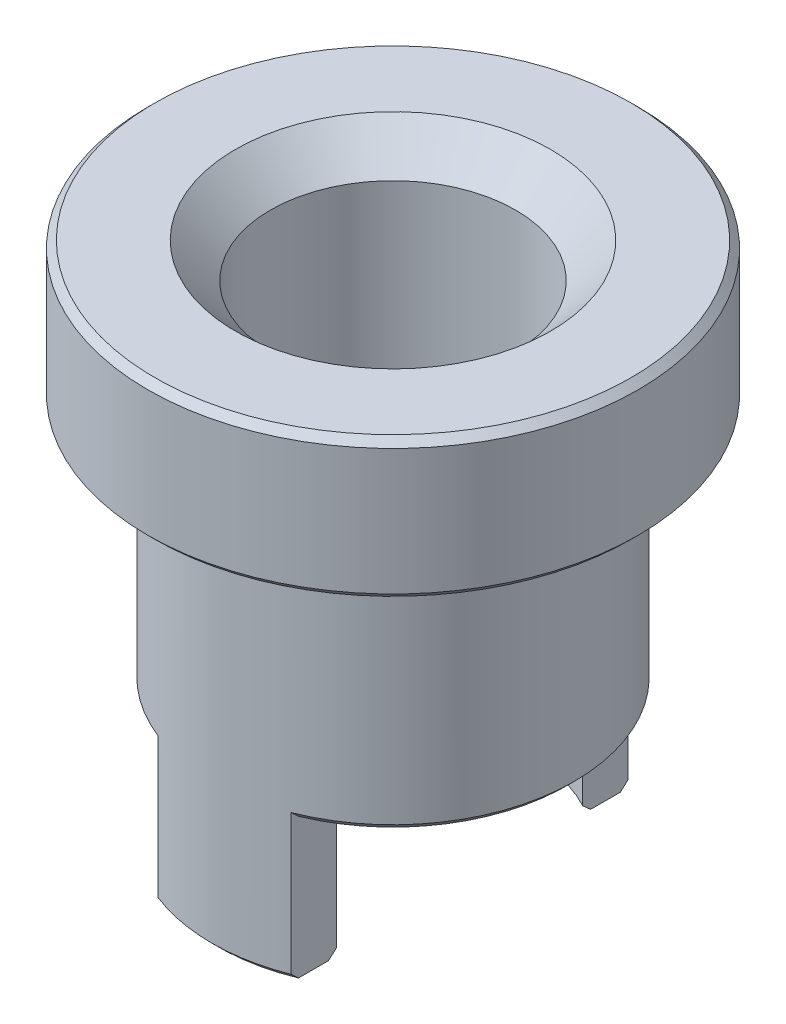
ISO-10303-21;
HEADER;
FILE_DESCRIPTION(('STEP AP214'),'2;1');
FILE_NAME('part.step','',(''),(''),'','','');
FILE_SCHEMA(('AUTOMOTIVE_DESIGN { 1 0 10303 214 1 1 1 1 }'));
ENDSEC;
DATA;
#1=APPLICATION_CONTEXT('core data for automotive mechanical design processes');
#2=APPLICATION_PROTOCOL_DEFINITION('international standard','automotive_design',2000,#1);
#3=PRODUCT_CONTEXT('',#1,'mechanical');
#4=PRODUCT('Part','Part','',(#3));
#5=PRODUCT_RELATED_PRODUCT_CATEGORY('part','',(#4));
#6=PRODUCT_DEFINITION_FORMATION('','',#4);
#7=PRODUCT_DEFINITION_CONTEXT('part definition',#1,'design');
#8=PRODUCT_DEFINITION('design','',#6,#7);
#9=PRODUCT_DEFINITION_SHAPE('','',#8);
#10=(LENGTH_UNIT() NAMED_UNIT(*) SI_UNIT(.MILLI.,.METRE.));
#11=(NAMED_UNIT(*) PLANE_ANGLE_UNIT() SI_UNIT($,.RADIAN.));
#12=(NAMED_UNIT(*) SI_UNIT($,.STERADIAN.) SOLID_ANGLE_UNIT());
#13=UNCERTAINTY_MEASURE_WITH_UNIT(LENGTH_MEASURE(1.E-05),#10,'distance_accuracy_value','');
#14=(GEOMETRIC_REPRESENTATION_CONTEXT(3) GLOBAL_UNCERTAINTY_ASSIGNED_CONTEXT((#13)) GLOBAL_UNIT_ASSIGNED_CONTEXT((#10,
#11,#12)) REPRESENTATION_CONTEXT('',''));
#15=CARTESIAN_POINT('',(0.,0.,0.));
#16=DIRECTION('',(0.,0.,1.));
#17=DIRECTION('',(1.,0.,0.));
#18=AXIS2_PLACEMENT_3D('',#15,#16,#17);
#19=CARTESIAN_POINT('',(1.9,4.,-7.));
#20=DIRECTION('',(0.,1.,0.));
#21=DIRECTION('',(0.,0.,1.));
#22=AXIS2_PLACEMENT_3D('',#19,#20,#21);
#23=PLANE('',#22);
#24=DIRECTION('',(0.,0.,1.));
#25=VECTOR('',#24,1.);
#26=CARTESIAN_POINT('',(-1.9,4.,-7.));
#27=LINE('',#26,#25);
#28=CARTESIAN_POINT('',(-1.9,4.,4.07921561087424));
#29=VERTEX_POINT('',#28);
#30=CARTESIAN_POINT('',(-1.9,4.,4.59789353943738));
#31=VERTEX_POINT('',#30);
#32=EDGE_CURVE('E385',#29,#31,#27,.T.);
#33=ORIENTED_EDGE('',*,*,#32,.T.);
#34=CARTESIAN_POINT('',(0.,4.,0.));
#35=DIRECTION('',(0.,1.,0.));
#36=DIRECTION('',(0.,0.,1.));
#37=AXIS2_PLACEMENT_3D('',#34,#35,#36);
#38=CIRCLE('',#37,4.975);
#39=CARTESIAN_POINT('',(-1.9,4.,-4.59789353943738));
#40=VERTEX_POINT('',#39);
#41=EDGE_CURVE('E325',#31,#40,#38,.F.);
#42=ORIENTED_EDGE('',*,*,#41,.T.);
#43=CARTESIAN_POINT('',(-1.9,4.,-4.07921561087424));
#44=VERTEX_POINT('',#43);
#45=EDGE_CURVE('E186',#40,#44,#27,.T.);
#46=ORIENTED_EDGE('',*,*,#45,.T.);
#47=CARTESIAN_POINT('',(0.,4.,0.));
#48=DIRECTION('',(0.,1.,0.));
#49=DIRECTION('',(0.,0.,1.));
#50=AXIS2_PLACEMENT_3D('',#47,#48,#49);
#51=CIRCLE('',#50,4.50000000000001);
#52=EDGE_CURVE('E192',#44,#29,#51,.T.);
#53=ORIENTED_EDGE('',*,*,#52,.T.);
#54=EDGE_LOOP('',(#33,#42,#46,#53));
#55=FACE_BOUND('',#54,.T.);
#56=ADVANCED_FACE('F39',(#55),#23,.F.);
#57=CARTESIAN_POINT('',(0.,26.7621951219513,0.));
#58=DIRECTION('',(0.,1.,0.));
#59=DIRECTION('',(0.,0.,1.));
#60=AXIS2_PLACEMENT_3D('',#57,#58,#59);
#61=CYLINDRICAL_SURFACE('',#60,3.5);
#62=CARTESIAN_POINT('',(0.,14.,0.));
#63=DIRECTION('',(0.,-1.,0.));
#64=DIRECTION('',(0.,0.,-1.));
#65=AXIS2_PLACEMENT_3D('',#62,#63,#64);
#66=CIRCLE('',#65,3.5);
#67=CARTESIAN_POINT('',(0.,14.,-3.5));
#68=VERTEX_POINT('',#67);
#69=EDGE_CURVE('E199',#68,#68,#66,.F.);
#70=ORIENTED_EDGE('',*,*,#69,.T.);
#71=EDGE_LOOP('',(#70));
#72=FACE_BOUND('',#71,.T.);
#73=CARTESIAN_POINT('',(0.,5.00000000000002,0.));
#74=DIRECTION('',(0.,1.,0.));
#75=DIRECTION('',(0.,0.,1.));
#76=AXIS2_PLACEMENT_3D('',#73,#74,#75);
#77=CIRCLE('',#76,3.5);
#78=CARTESIAN_POINT('',(0.,5.00000000000002,3.5));
#79=VERTEX_POINT('',#78);
#80=EDGE_CURVE('E438',#79,#79,#77,.F.);
#81=ORIENTED_EDGE('',*,*,#80,.T.);
#82=EDGE_LOOP('',(#81));
#83=FACE_BOUND('',#82,.T.);
#84=ADVANCED_FACE('F238',(#72,#83),#61,.F.);
#85=CARTESIAN_POINT('',(1.9,0.,-7.));
#86=DIRECTION('',(-1.,0.,0.));
#87=DIRECTION('',(0.,0.,1.));
#88=AXIS2_PLACEMENT_3D('',#85,#86,#87);
#89=PLANE('',#88);
#90=DIRECTION('',(0.,1.,0.));
#91=VECTOR('',#90,1.);
#92=CARTESIAN_POINT('',(1.9,26.7621951219513,4.81358753945537));
#93=LINE('',#92,#91);
#94=CARTESIAN_POINT('',(1.9,0.200000000000002,4.81358753945537));
#95=VERTEX_POINT('',#94);
#96=CARTESIAN_POINT('',(1.9,4.2,4.81358753945537));
#97=VERTEX_POINT('',#96);
#98=EDGE_CURVE('E308',#95,#97,#93,.T.);
#99=ORIENTED_EDGE('',*,*,#98,.F.);
#100=CARTESIAN_POINT('',(1.9,0.200000000000002,4.81358753945537));
#101=CARTESIAN_POINT('',(1.9,0.166609066003938,4.77769194990853));
#102=CARTESIAN_POINT('',(1.9,0.133246932549666,4.74176965536128));
#103=CARTESIAN_POINT('',(1.9,0.0665802658815418,4.66987165535664));
#104=CARTESIAN_POINT('',(1.9,0.0332757326691459,4.63389594989789));
#105=CARTESIAN_POINT('',(1.9,0.,4.59789353943738));
#106=B_SPLINE_CURVE_WITH_KNOTS('',3,(#100,#101,#102,#103,#104,#105),.UNSPECIFIED.,.F.,.F.,(4,2,
4),(0.,0.147074772641127,0.294149549002513),.UNSPECIFIED.);
#107=CARTESIAN_POINT('',(1.9,0.,4.59789353943738));
#108=VERTEX_POINT('',#107);
#109=EDGE_CURVE('E268',#95,#108,#106,.T.);
#110=ORIENTED_EDGE('',*,*,#109,.T.);
#111=DIRECTION('',(0.,0.,1.));
#112=VECTOR('',#111,1.);
#113=CARTESIAN_POINT('',(1.9,0.,-7.));
#114=LINE('',#113,#112);
#115=CARTESIAN_POINT('',(1.9,0.,3.74566416006561));
#116=VERTEX_POINT('',#115);
#117=EDGE_CURVE('E426',#116,#108,#114,.T.);
#118=ORIENTED_EDGE('',*,*,#117,.F.);
#119=CARTESIAN_POINT('',(1.9,0.,3.74566416006561));
#120=CARTESIAN_POINT('',(1.9,0.033458009401076,3.70815447063527));
#121=CARTESIAN_POINT('',(1.9,0.0668536796561595,3.67058954562483));
#122=CARTESIAN_POINT('',(1.9,0.133520346339527,3.59534921940429));
#123=CARTESIAN_POINT('',(1.9,0.16679134275111,3.5576738181794));
#124=CARTESIAN_POINT('',(1.9,0.199999999999999,3.51994318135961));
#125=B_SPLINE_CURVE_WITH_KNOTS('',3,(#119,#120,#121,#122,#123,#124),.UNSPECIFIED.,.F.,.F.,(4,2,
4),(0.,0.150789752454997,0.301579525109123),.UNSPECIFIED.);
#126=CARTESIAN_POINT('',(1.9,0.199999999999999,3.51994318135961));
#127=VERTEX_POINT('',#126);
#128=EDGE_CURVE('E263',#116,#127,#125,.T.);
#129=ORIENTED_EDGE('',*,*,#128,.T.);
#130=DIRECTION('',(0.,1.,0.));
#131=VECTOR('',#130,1.);
#132=CARTESIAN_POINT('',(1.9,0.,3.51994318135961));
#133=LINE('',#132,#131);
#134=CARTESIAN_POINT('',(1.9,4.50000000000001,3.51994318135961));
#135=VERTEX_POINT('',#134);
#136=EDGE_CURVE('E169',#135,#127,#133,.F.);
#137=ORIENTED_EDGE('',*,*,#136,.F.);
#138=CARTESIAN_POINT('',(1.9,4.50000000000001,3.51994318135961));
#139=CARTESIAN_POINT('',(1.9,4.45869946590342,3.56687547386379));
#140=CARTESIAN_POINT('',(1.9,4.41729486416082,3.61371604128772));
#141=CARTESIAN_POINT('',(1.9,4.33429720303416,3.70722880390633));
#142=CARTESIAN_POINT('',(1.9,4.29270414620101,3.75390100136478));
#143=CARTESIAN_POINT('',(1.9,4.20934823034379,3.84709326326857));
#144=CARTESIAN_POINT('',(1.9,4.16758537170122,3.8936133280553));
#145=CARTESIAN_POINT('',(1.9,4.08390479364052,3.9865151180706));
#146=CARTESIAN_POINT('',(1.9,4.04198707214102,4.0328968414246));
#147=CARTESIAN_POINT('',(1.9,4.,4.07921561087424));
#148=B_SPLINE_CURVE_WITH_KNOTS('',3,(#138,#139,#140,#141,#142,#143,#144,#145,#146,#147),
.UNSPECIFIED.,.F.,.F.,(4,2,2,2,4),(0.,0.187550662890622,0.375098794652739,0.562646505258816,
0.750196745741383),.UNSPECIFIED.);
#149=CARTESIAN_POINT('',(1.9,4.,4.07921561087424));
#150=VERTEX_POINT('',#149);
#151=EDGE_CURVE('E161',#135,#150,#148,.T.);
#152=ORIENTED_EDGE('',*,*,#151,.T.);
#153=DIRECTION('',(0.,0.,1.));
#154=VECTOR('',#153,1.);
#155=CARTESIAN_POINT('',(1.9,4.,-7.));
#156=LINE('',#155,#154);
#157=CARTESIAN_POINT('',(1.9,4.,4.59789353943738));
#158=VERTEX_POINT('',#157);
#159=EDGE_CURVE('E166',#150,#158,#156,.T.);
#160=ORIENTED_EDGE('',*,*,#159,.T.);
#161=CARTESIAN_POINT('',(1.9,4.,4.59789353943738));
#162=CARTESIAN_POINT('',(1.9,4.03327573266915,4.63389594989789));
#163=CARTESIAN_POINT('',(1.9,4.06658026588154,4.66987165535664));
#164=CARTESIAN_POINT('',(1.9,4.13324693254967,4.74176965536128));
#165=CARTESIAN_POINT('',(1.9,4.16660906600394,4.77769194990853));
#166=CARTESIAN_POINT('',(1.9,4.2,4.81358753945537));
#167=B_SPLINE_CURVE_WITH_KNOTS('',3,(#161,#162,#163,#164,#165,#166),.UNSPECIFIED.,.F.,.F.,(4,2,
4),(0.,0.147074776361389,0.294149549002517),.UNSPECIFIED.);
#168=EDGE_CURVE('E280',#158,#97,#167,.T.);
#169=ORIENTED_EDGE('',*,*,#168,.T.);
#170=EDGE_LOOP('',(#99,#110,#118,#129,#137,#152,#160,#169));
#171=FACE_BOUND('',#170,.T.);
#172=ADVANCED_FACE('F164',(#171),#89,.F.);
#173=CARTESIAN_POINT('',(1.9,0.,-4.59789353943738));
#174=VERTEX_POINT('',#173);
#175=CARTESIAN_POINT('',(1.9,0.,-3.74566416006561));
#176=VERTEX_POINT('',#175);
#177=EDGE_CURVE('E427',#174,#176,#114,.T.);
#178=ORIENTED_EDGE('',*,*,#177,.F.);
#179=CARTESIAN_POINT('',(1.9,0.,-4.59789353943738));
#180=CARTESIAN_POINT('',(1.9,0.0332757326691458,-4.63389594989789));
#181=CARTESIAN_POINT('',(1.9,0.0665802658815416,-4.66987165535664));
#182=CARTESIAN_POINT('',(1.9,0.133246932549666,-4.74176965536128));
#183=CARTESIAN_POINT('',(1.9,0.166609066003937,-4.77769194990853));
#184=CARTESIAN_POINT('',(1.9,0.200000000000002,-4.81358753945537));
#185=B_SPLINE_CURVE_WITH_KNOTS('',3,(#179,#180,#181,#182,#183,#184),.UNSPECIFIED.,.F.,.F.,(4,2,
4),(0.,0.147074776361387,0.294149549002513),.UNSPECIFIED.);
#186=CARTESIAN_POINT('',(1.9,0.200000000000002,-4.81358753945537));
#187=VERTEX_POINT('',#186);
#188=EDGE_CURVE('E255',#174,#187,#185,.T.);
#189=ORIENTED_EDGE('',*,*,#188,.T.);
#190=DIRECTION('',(0.,1.,0.));
#191=VECTOR('',#190,1.);
#192=CARTESIAN_POINT('',(1.9,26.7621951219513,-4.81358753945537));
#193=LINE('',#192,#191);
#194=CARTESIAN_POINT('',(1.9,4.2,-4.81358753945537));
#195=VERTEX_POINT('',#194);
#196=EDGE_CURVE('E429',#195,#187,#193,.F.);
#197=ORIENTED_EDGE('',*,*,#196,.F.);
#198=CARTESIAN_POINT('',(1.9,4.2,-4.81358753945537));
#199=CARTESIAN_POINT('',(1.9,4.16660906600394,-4.77769194990853));
#200=CARTESIAN_POINT('',(1.9,4.13324693254967,-4.74176965536128));
#201=CARTESIAN_POINT('',(1.9,4.06658026588154,-4.66987165535664));
#202=CARTESIAN_POINT('',(1.9,4.03327573266915,-4.63389594989789));
#203=CARTESIAN_POINT('',(1.9,4.,-4.59789353943738));
#204=B_SPLINE_CURVE_WITH_KNOTS('',3,(#198,#199,#200,#201,#202,#203),.UNSPECIFIED.,.F.,.F.,(4,2,
4),(0.,0.147074772641128,0.294149549002517),.UNSPECIFIED.);
#205=CARTESIAN_POINT('',(1.9,4.,-4.59789353943738));
#206=VERTEX_POINT('',#205);
#207=EDGE_CURVE('E274',#195,#206,#204,.T.);
#208=ORIENTED_EDGE('',*,*,#207,.T.);
#209=CARTESIAN_POINT('',(1.9,4.,-4.07921561087424));
#210=VERTEX_POINT('',#209);
#211=EDGE_CURVE('E185',#206,#210,#156,.T.);
#212=ORIENTED_EDGE('',*,*,#211,.T.);
#213=CARTESIAN_POINT('',(1.9,4.,-4.07921561087424));
#214=CARTESIAN_POINT('',(1.9,4.04198707214102,-4.0328968414246));
#215=CARTESIAN_POINT('',(1.9,4.08390479364052,-3.9865151180706));
#216=CARTESIAN_POINT('',(1.9,4.16758537170122,-3.8936133280553));
#217=CARTESIAN_POINT('',(1.9,4.20934823034379,-3.84709326326857));
#218=CARTESIAN_POINT('',(1.9,4.29270414620101,-3.75390100136478));
#219=CARTESIAN_POINT('',(1.9,4.33429720303416,-3.70722880390633));
#220=CARTESIAN_POINT('',(1.9,4.41729486416081,-3.61371604128772));
#221=CARTESIAN_POINT('',(1.9,4.45869946590342,-3.56687547386379));
#222=CARTESIAN_POINT('',(1.9,4.50000000000001,-3.51994318135961));
#223=B_SPLINE_CURVE_WITH_KNOTS('',3,(#213,#214,#215,#216,#217,#218,#219,#220,#221,#222),
.UNSPECIFIED.,.F.,.F.,(4,2,2,2,4),(0.,0.187550240482567,0.375097951088643,0.56264608285076,
0.750196745741382),.UNSPECIFIED.);
#224=CARTESIAN_POINT('',(1.9,4.50000000000001,-3.51994318135961));
#225=VERTEX_POINT('',#224);
#226=EDGE_CURVE('E174',#210,#225,#223,.T.);
#227=ORIENTED_EDGE('',*,*,#226,.T.);
#228=DIRECTION('',(0.,1.,0.));
#229=VECTOR('',#228,1.);
#230=CARTESIAN_POINT('',(1.9,0.,-3.51994318135961));
#231=LINE('',#230,#229);
#232=CARTESIAN_POINT('',(1.9,0.199999999999999,-3.51994318135961));
#233=VERTEX_POINT('',#232);
#234=EDGE_CURVE('E417',#233,#225,#231,.T.);
#235=ORIENTED_EDGE('',*,*,#234,.F.);
#236=CARTESIAN_POINT('',(1.9,0.199999999999999,-3.51994318135961));
#237=CARTESIAN_POINT('',(1.9,0.16679134275111,-3.5576738181794));
#238=CARTESIAN_POINT('',(1.9,0.133520346339527,-3.59534921940429));
#239=CARTESIAN_POINT('',(1.9,0.0668536796561595,-3.67058954562483));
#240=CARTESIAN_POINT('',(1.9,0.033458009401076,-3.70815447063527));
#241=CARTESIAN_POINT('',(1.9,0.,-3.74566416006561));
#242=B_SPLINE_CURVE_WITH_KNOTS('',3,(#236,#237,#238,#239,#240,#241),.UNSPECIFIED.,.F.,.F.,(4,2,
4),(0.,0.150789772654126,0.301579525109123),.UNSPECIFIED.);
#243=EDGE_CURVE('E247',#233,#176,#242,.T.);
#244=ORIENTED_EDGE('',*,*,#243,.T.);
#245=EDGE_LOOP('',(#178,#189,#197,#208,#212,#227,#235,#244));
#246=FACE_BOUND('',#245,.T.);
#247=ADVANCED_FACE('F237',(#246),#89,.F.);
#248=CARTESIAN_POINT('',(-1.9,4.,-7.));
#249=DIRECTION('',(1.,0.,0.));
#250=DIRECTION('',(0.,1.,0.));
#251=AXIS2_PLACEMENT_3D('',#248,#249,#250);
#252=PLANE('',#251);
#253=DIRECTION('',(0.,1.,0.));
#254=VECTOR('',#253,1.);
#255=CARTESIAN_POINT('',(-1.9,26.7621951219513,-4.81358753945537));
#256=LINE('',#255,#254);
#257=CARTESIAN_POINT('',(-1.9,0.200000000000002,-4.81358753945537));
#258=VERTEX_POINT('',#257);
#259=CARTESIAN_POINT('',(-1.9,4.2,-4.81358753945537));
#260=VERTEX_POINT('',#259);
#261=EDGE_CURVE('E380',#258,#260,#256,.T.);
#262=ORIENTED_EDGE('',*,*,#261,.F.);
#263=CARTESIAN_POINT('',(-1.9,0.200000000000002,-4.81358753945537));
#264=CARTESIAN_POINT('',(-1.9,0.166609066003938,-4.77769194990853));
#265=CARTESIAN_POINT('',(-1.9,0.133246932549666,-4.74176965536128));
#266=CARTESIAN_POINT('',(-1.9,0.0665802658815415,-4.66987165535664));
#267=CARTESIAN_POINT('',(-1.9,0.0332757326691458,-4.63389594989789));
#268=CARTESIAN_POINT('',(-1.9,0.,-4.59789353943738));
#269=B_SPLINE_CURVE_WITH_KNOTS('',3,(#263,#264,#265,#266,#267,#268),.UNSPECIFIED.,.F.,.F.,(4,2,
4),(0.,0.147074772641127,0.294149549002514),.UNSPECIFIED.);
#270=CARTESIAN_POINT('',(-1.9,0.,-4.59789353943738));
#271=VERTEX_POINT('',#270);
#272=EDGE_CURVE('E332',#258,#271,#269,.T.);
#273=ORIENTED_EDGE('',*,*,#272,.T.);
#274=DIRECTION('',(0.,0.,1.));
#275=VECTOR('',#274,1.);
#276=CARTESIAN_POINT('',(-1.9,0.,-7.));
#277=LINE('',#276,#275);
#278=CARTESIAN_POINT('',(-1.9,0.,-3.74566416006561));
#279=VERTEX_POINT('',#278);
#280=EDGE_CURVE('E378',#271,#279,#277,.T.);
#281=ORIENTED_EDGE('',*,*,#280,.T.);
#282=CARTESIAN_POINT('',(-1.9,0.,-3.74566416006561));
#283=CARTESIAN_POINT('',(-1.9,0.033458009401076,-3.70815447063527));
#284=CARTESIAN_POINT('',(-1.9,0.0668536796561595,-3.67058954562483));
#285=CARTESIAN_POINT('',(-1.9,0.133520346339527,-3.59534921940429));
#286=CARTESIAN_POINT('',(-1.9,0.16679134275111,-3.5576738181794));
#287=CARTESIAN_POINT('',(-1.9,0.199999999999999,-3.51994318135961));
#288=B_SPLINE_CURVE_WITH_KNOTS('',3,(#282,#283,#284,#285,#286,#287),.UNSPECIFIED.,.F.,.F.,(4,2,
4),(0.,0.150789752454997,0.301579525109123),.UNSPECIFIED.);
#289=CARTESIAN_POINT('',(-1.9,0.199999999999999,-3.51994318135961));
#290=VERTEX_POINT('',#289);
#291=EDGE_CURVE('E327',#279,#290,#288,.T.);
#292=ORIENTED_EDGE('',*,*,#291,.T.);
#293=DIRECTION('',(0.,1.,0.));
#294=VECTOR('',#293,1.);
#295=CARTESIAN_POINT('',(-1.9,0.,-3.51994318135961));
#296=LINE('',#295,#294);
#297=CARTESIAN_POINT('',(-1.9,4.50000000000001,-3.51994318135961));
#298=VERTEX_POINT('',#297);
#299=EDGE_CURVE('E416',#298,#290,#296,.F.);
#300=ORIENTED_EDGE('',*,*,#299,.F.);
#301=CARTESIAN_POINT('',(-1.9,4.50000000000001,-3.51994318135961));
#302=CARTESIAN_POINT('',(-1.9,4.45869946590342,-3.56687547386379));
#303=CARTESIAN_POINT('',(-1.9,4.41729486416082,-3.61371604128772));
#304=CARTESIAN_POINT('',(-1.9,4.33429720303416,-3.70722880390633));
#305=CARTESIAN_POINT('',(-1.9,4.29270414620101,-3.75390100136478));
#306=CARTESIAN_POINT('',(-1.9,4.20934823034379,-3.84709326326857));
#307=CARTESIAN_POINT('',(-1.9,4.16758537170122,-3.8936133280553));
#308=CARTESIAN_POINT('',(-1.9,4.08390479364052,-3.9865151180706));
#309=CARTESIAN_POINT('',(-1.9,4.04198707214102,-4.0328968414246));
#310=CARTESIAN_POINT('',(-1.9,4.,-4.07921561087424));
#311=B_SPLINE_CURVE_WITH_KNOTS('',3,(#301,#302,#303,#304,#305,#306,#307,#308,#309,#310),
.UNSPECIFIED.,.F.,.F.,(4,2,2,2,4),(0.,0.187550662890622,0.375098794652739,0.562646505258815,
0.750196745741382),.UNSPECIFIED.);
#312=EDGE_CURVE('E406',#298,#44,#311,.T.);
#313=ORIENTED_EDGE('',*,*,#312,.T.);
#314=ORIENTED_EDGE('',*,*,#45,.F.);
#315=CARTESIAN_POINT('',(-1.9,4.,-4.59789353943738));
#316=CARTESIAN_POINT('',(-1.9,4.03327573266915,-4.63389594989789));
#317=CARTESIAN_POINT('',(-1.9,4.06658026588154,-4.66987165535664));
#318=CARTESIAN_POINT('',(-1.9,4.13324693254967,-4.74176965536128));
#319=CARTESIAN_POINT('',(-1.9,4.16660906600394,-4.77769194990853));
#320=CARTESIAN_POINT('',(-1.9,4.2,-4.81358753945537));
#321=B_SPLINE_CURVE_WITH_KNOTS('',3,(#315,#316,#317,#318,#319,#320),.UNSPECIFIED.,.F.,.F.,(4,2,
4),(0.,0.147074776361389,0.294149549002517),.UNSPECIFIED.);
#322=EDGE_CURVE('E11',#40,#260,#321,.T.);
#323=ORIENTED_EDGE('',*,*,#322,.T.);
#324=EDGE_LOOP('',(#262,#273,#281,#292,#300,#313,#314,#323));
#325=FACE_BOUND('',#324,.T.);
#326=ADVANCED_FACE('F209',(#325),#252,.F.);
#327=CARTESIAN_POINT('',(-1.9,0.,3.74566416006561));
#328=VERTEX_POINT('',#327);
#329=CARTESIAN_POINT('',(-1.9,0.,4.59789353943738));
#330=VERTEX_POINT('',#329);
#331=EDGE_CURVE('E386',#328,#330,#277,.T.);
#332=ORIENTED_EDGE('',*,*,#331,.T.);
#333=CARTESIAN_POINT('',(-1.9,0.,4.59789353943738));
#334=CARTESIAN_POINT('',(-1.9,0.0332757326691459,4.63389594989789));
#335=CARTESIAN_POINT('',(-1.9,0.0665802658815418,4.66987165535664));
#336=CARTESIAN_POINT('',(-1.9,0.133246932549666,4.74176965536128));
#337=CARTESIAN_POINT('',(-1.9,0.166609066003938,4.77769194990853));
#338=CARTESIAN_POINT('',(-1.9,0.200000000000003,4.81358753945537));
#339=B_SPLINE_CURVE_WITH_KNOTS('',3,(#333,#334,#335,#336,#337,#338),.UNSPECIFIED.,.F.,.F.,(4,2,
4),(0.,0.147074776361387,0.294149549002514),.UNSPECIFIED.);
#340=CARTESIAN_POINT('',(-1.9,0.200000000000002,4.81358753945537));
#341=VERTEX_POINT('',#340);
#342=EDGE_CURVE('E347',#330,#341,#339,.T.);
#343=ORIENTED_EDGE('',*,*,#342,.T.);
#344=DIRECTION('',(0.,1.,0.));
#345=VECTOR('',#344,1.);
#346=CARTESIAN_POINT('',(-1.9,26.7621951219513,4.81358753945537));
#347=LINE('',#346,#345);
#348=CARTESIAN_POINT('',(-1.9,4.2,4.81358753945537));
#349=VERTEX_POINT('',#348);
#350=EDGE_CURVE('E432',#349,#341,#347,.F.);
#351=ORIENTED_EDGE('',*,*,#350,.F.);
#352=CARTESIAN_POINT('',(-1.9,4.2,4.81358753945537));
#353=CARTESIAN_POINT('',(-1.9,4.16660906600394,4.77769194990853));
#354=CARTESIAN_POINT('',(-1.9,4.13324693254967,4.74176965536128));
#355=CARTESIAN_POINT('',(-1.9,4.06658026588154,4.66987165535664));
#356=CARTESIAN_POINT('',(-1.9,4.03327573266915,4.63389594989789));
#357=CARTESIAN_POINT('',(-1.9,4.,4.59789353943738));
#358=B_SPLINE_CURVE_WITH_KNOTS('',3,(#352,#353,#354,#355,#356,#357),.UNSPECIFIED.,.F.,.F.,(4,2,
4),(0.,0.147074772641128,0.294149549002518),.UNSPECIFIED.);
#359=EDGE_CURVE('E53',#349,#31,#358,.T.);
#360=ORIENTED_EDGE('',*,*,#359,.T.);
#361=ORIENTED_EDGE('',*,*,#32,.F.);
#362=CARTESIAN_POINT('',(-1.9,4.,4.07921561087424));
#363=CARTESIAN_POINT('',(-1.9,4.04198707214102,4.0328968414246));
#364=CARTESIAN_POINT('',(-1.9,4.08390479364052,3.9865151180706));
#365=CARTESIAN_POINT('',(-1.9,4.16758537170122,3.8936133280553));
#366=CARTESIAN_POINT('',(-1.9,4.20934823034379,3.84709326326857));
#367=CARTESIAN_POINT('',(-1.9,4.29270414620101,3.75390100136478));
#368=CARTESIAN_POINT('',(-1.9,4.33429720303416,3.70722880390633));
#369=CARTESIAN_POINT('',(-1.9,4.41729486416081,3.61371604128772));
#370=CARTESIAN_POINT('',(-1.9,4.45869946590342,3.56687547386379));
#371=CARTESIAN_POINT('',(-1.9,4.50000000000001,3.51994318135961));
#372=B_SPLINE_CURVE_WITH_KNOTS('',3,(#362,#363,#364,#365,#366,#367,#368,#369,#370,#371),
.UNSPECIFIED.,.F.,.F.,(4,2,2,2,4),(0.,0.187550240482567,0.375097951088643,0.562646082850759,
0.750196745741382),.UNSPECIFIED.);
#373=CARTESIAN_POINT('',(-1.9,4.50000000000001,3.51994318135961));
#374=VERTEX_POINT('',#373);
#375=EDGE_CURVE('E196',#29,#374,#372,.T.);
#376=ORIENTED_EDGE('',*,*,#375,.T.);
#377=DIRECTION('',(0.,1.,0.));
#378=VECTOR('',#377,1.);
#379=CARTESIAN_POINT('',(-1.9,0.,3.51994318135961));
#380=LINE('',#379,#378);
#381=CARTESIAN_POINT('',(-1.9,0.199999999999999,3.51994318135961));
#382=VERTEX_POINT('',#381);
#383=EDGE_CURVE('E436',#382,#374,#380,.T.);
#384=ORIENTED_EDGE('',*,*,#383,.F.);
#385=CARTESIAN_POINT('',(-1.9,0.199999999999999,3.51994318135961));
#386=CARTESIAN_POINT('',(-1.9,0.16679134275111,3.5576738181794));
#387=CARTESIAN_POINT('',(-1.9,0.133520346339527,3.59534921940429));
#388=CARTESIAN_POINT('',(-1.9,0.0668536796561595,3.67058954562483));
#389=CARTESIAN_POINT('',(-1.9,0.033458009401076,3.70815447063527));
#390=CARTESIAN_POINT('',(-1.9,0.,3.74566416006561));
#391=B_SPLINE_CURVE_WITH_KNOTS('',3,(#385,#386,#387,#388,#389,#390),.UNSPECIFIED.,.F.,.F.,(4,2,
4),(0.,0.150789772654126,0.301579525109123),.UNSPECIFIED.);
#392=EDGE_CURVE('E60',#382,#328,#391,.T.);
#393=ORIENTED_EDGE('',*,*,#392,.T.);
#394=EDGE_LOOP('',(#332,#343,#351,#360,#361,#376,#384,#393));
#395=FACE_BOUND('',#394,.T.);
#396=ADVANCED_FACE('F420',(#395),#252,.F.);
#397=CARTESIAN_POINT('',(0.,0.,0.));
#398=DIRECTION('',(0.,1.,0.));
#399=DIRECTION('',(0.,0.,1.));
#400=AXIS2_PLACEMENT_3D('',#397,#398,#399);
#401=PLANE('',#400);
#402=ORIENTED_EDGE('',*,*,#117,.T.);
#403=CARTESIAN_POINT('',(0.,0.,0.));
#404=DIRECTION('',(0.,1.,0.));
#405=DIRECTION('',(0.,0.,1.));
#406=AXIS2_PLACEMENT_3D('',#403,#404,#405);
#407=CIRCLE('',#406,4.975);
#408=EDGE_CURVE('E68',#108,#330,#407,.F.);
#409=ORIENTED_EDGE('',*,*,#408,.T.);
#410=ORIENTED_EDGE('',*,*,#331,.F.);
#411=CARTESIAN_POINT('',(0.,0.,0.));
#412=DIRECTION('',(0.,1.,0.));
#413=DIRECTION('',(0.,0.,1.));
#414=AXIS2_PLACEMENT_3D('',#411,#412,#413);
#415=CIRCLE('',#414,4.2);
#416=EDGE_CURVE('E356',#328,#116,#415,.T.);
#417=ORIENTED_EDGE('',*,*,#416,.T.);
#418=EDGE_LOOP('',(#402,#409,#410,#417));
#419=FACE_BOUND('',#418,.T.);
#420=ADVANCED_FACE('F479',(#419),#401,.F.);
#421=CARTESIAN_POINT('',(0.,15.,0.));
#422=DIRECTION('',(0.,-1.,0.));
#423=DIRECTION('',(0.,0.,-1.));
#424=AXIS2_PLACEMENT_3D('',#421,#422,#423);
#425=PLANE('',#424);
#426=CARTESIAN_POINT('',(0.,15.,0.));
#427=DIRECTION('',(0.,-1.,0.));
#428=DIRECTION('',(0.,0.,-1.));
#429=AXIS2_PLACEMENT_3D('',#426,#427,#428);
#430=CIRCLE('',#429,6.8);
#431=CARTESIAN_POINT('',(0.,15.,-6.8));
#432=VERTEX_POINT('',#431);
#433=EDGE_CURVE('E390',#432,#432,#430,.F.);
#434=ORIENTED_EDGE('',*,*,#433,.T.);
#435=EDGE_LOOP('',(#434));
#436=FACE_BOUND('',#435,.T.);
#437=CARTESIAN_POINT('',(0.,15.,0.));
#438=DIRECTION('',(0.,-1.,0.));
#439=DIRECTION('',(0.,0.,-1.));
#440=AXIS2_PLACEMENT_3D('',#437,#438,#439);
#441=CIRCLE('',#440,4.50000000000001);
#442=CARTESIAN_POINT('',(0.,15.,-4.50000000000001));
#443=VERTEX_POINT('',#442);
#444=EDGE_CURVE('E193',#443,#443,#441,.T.);
#445=ORIENTED_EDGE('',*,*,#444,.T.);
#446=EDGE_LOOP('',(#445));
#447=FACE_BOUND('',#446,.T.);
#448=ADVANCED_FACE('F478',(#436,#447),#425,.F.);
#449=ORIENTED_EDGE('',*,*,#280,.F.);
#450=CARTESIAN_POINT('',(0.,0.,0.));
#451=DIRECTION('',(0.,1.,0.));
#452=DIRECTION('',(0.,0.,1.));
#453=AXIS2_PLACEMENT_3D('',#450,#451,#452);
#454=CIRCLE('',#453,4.975);
#455=EDGE_CURVE('E368',#271,#174,#454,.F.);
#456=ORIENTED_EDGE('',*,*,#455,.T.);
#457=ORIENTED_EDGE('',*,*,#177,.T.);
#458=CARTESIAN_POINT('',(0.,0.,0.));
#459=DIRECTION('',(0.,1.,0.));
#460=DIRECTION('',(0.,0.,1.));
#461=AXIS2_PLACEMENT_3D('',#458,#459,#460);
#462=CIRCLE('',#461,4.2);
#463=EDGE_CURVE('E370',#176,#279,#462,.T.);
#464=ORIENTED_EDGE('',*,*,#463,.T.);
#465=EDGE_LOOP('',(#449,#456,#457,#464));
#466=FACE_BOUND('',#465,.T.);
#467=ADVANCED_FACE('F384',(#466),#401,.F.);
#468=CARTESIAN_POINT('',(0.,26.7621951219513,0.));
#469=DIRECTION('',(0.,1.,0.));
#470=DIRECTION('',(0.,0.,1.));
#471=AXIS2_PLACEMENT_3D('',#468,#469,#470);
#472=CYLINDRICAL_SURFACE('',#471,5.175);
#473=CARTESIAN_POINT('',(0.,10.8,0.));
#474=DIRECTION('',(0.,1.,0.));
#475=DIRECTION('',(0.,0.,1.));
#476=AXIS2_PLACEMENT_3D('',#473,#474,#475);
#477=CIRCLE('',#476,5.175);
#478=CARTESIAN_POINT('',(0.,10.8,5.175));
#479=VERTEX_POINT('',#478);
#480=EDGE_CURVE('E314',#479,#479,#477,.F.);
#481=ORIENTED_EDGE('',*,*,#480,.T.);
#482=EDGE_LOOP('',(#481));
#483=FACE_BOUND('',#482,.T.);
#484=CARTESIAN_POINT('',(0.,4.2,0.));
#485=DIRECTION('',(0.,1.,0.));
#486=DIRECTION('',(0.,0.,1.));
#487=AXIS2_PLACEMENT_3D('',#484,#485,#486);
#488=CIRCLE('',#487,5.175);
#489=EDGE_CURVE('E311',#97,#195,#488,.T.);
#490=ORIENTED_EDGE('',*,*,#489,.T.);
#491=ORIENTED_EDGE('',*,*,#196,.T.);
#492=CARTESIAN_POINT('',(0.,0.200000000000002,0.));
#493=DIRECTION('',(0.,1.,0.));
#494=DIRECTION('',(0.,0.,1.));
#495=AXIS2_PLACEMENT_3D('',#492,#493,#494);
#496=CIRCLE('',#495,5.175);
#497=EDGE_CURVE('E320',#187,#258,#496,.T.);
#498=ORIENTED_EDGE('',*,*,#497,.T.);
#499=ORIENTED_EDGE('',*,*,#261,.T.);
#500=CARTESIAN_POINT('',(0.,4.2,0.));
#501=DIRECTION('',(0.,1.,0.));
#502=DIRECTION('',(0.,0.,1.));
#503=AXIS2_PLACEMENT_3D('',#500,#501,#502);
#504=CIRCLE('',#503,5.175);
#505=EDGE_CURVE('E315',#260,#349,#504,.T.);
#506=ORIENTED_EDGE('',*,*,#505,.T.);
#507=ORIENTED_EDGE('',*,*,#350,.T.);
#508=CARTESIAN_POINT('',(0.,0.200000000000002,0.));
#509=DIRECTION('',(0.,1.,0.));
#510=DIRECTION('',(0.,0.,1.));
#511=AXIS2_PLACEMENT_3D('',#508,#509,#510);
#512=CIRCLE('',#511,5.175);
#513=EDGE_CURVE('E388',#341,#95,#512,.T.);
#514=ORIENTED_EDGE('',*,*,#513,.T.);
#515=ORIENTED_EDGE('',*,*,#98,.T.);
#516=EDGE_LOOP('',(#490,#491,#498,#499,#506,#507,#514,#515));
#517=FACE_BOUND('',#516,.T.);
#518=ADVANCED_FACE('F469',(#483,#517),#472,.T.);
#519=CARTESIAN_POINT('',(0.,11.,0.));
#520=DIRECTION('',(0.,1.,0.));
#521=DIRECTION('',(0.,0.,1.));
#522=AXIS2_PLACEMENT_3D('',#519,#520,#521);
#523=PLANE('',#522);
#524=CARTESIAN_POINT('',(0.,11.,0.));
#525=DIRECTION('',(0.,1.,0.));
#526=DIRECTION('',(0.,0.,1.));
#527=AXIS2_PLACEMENT_3D('',#524,#525,#526);
#528=CIRCLE('',#527,6.80000000000001);
#529=CARTESIAN_POINT('',(0.,11.,6.80000000000001));
#530=VERTEX_POINT('',#529);
#531=EDGE_CURVE('E395',#530,#530,#528,.F.);
#532=ORIENTED_EDGE('',*,*,#531,.T.);
#533=EDGE_LOOP('',(#532));
#534=FACE_BOUND('',#533,.T.);
#535=CARTESIAN_POINT('',(0.,11.,0.));
#536=DIRECTION('',(0.,1.,0.));
#537=DIRECTION('',(0.,0.,1.));
#538=AXIS2_PLACEMENT_3D('',#535,#536,#537);
#539=CIRCLE('',#538,5.375);
#540=CARTESIAN_POINT('',(0.,11.,5.375));
#541=VERTEX_POINT('',#540);
#542=EDGE_CURVE('E398',#541,#541,#539,.T.);
#543=ORIENTED_EDGE('',*,*,#542,.T.);
#544=EDGE_LOOP('',(#543));
#545=FACE_BOUND('',#544,.T.);
#546=ADVANCED_FACE('F464',(#534,#545),#523,.F.);
#547=CARTESIAN_POINT('',(0.,26.7621951219513,0.));
#548=DIRECTION('',(0.,1.,0.));
#549=DIRECTION('',(0.,0.,1.));
#550=AXIS2_PLACEMENT_3D('',#547,#548,#549);
#551=CYLINDRICAL_SURFACE('',#550,7.);
#552=CARTESIAN_POINT('',(0.,11.2,0.));
#553=DIRECTION('',(0.,1.,0.));
#554=DIRECTION('',(0.,0.,1.));
#555=AXIS2_PLACEMENT_3D('',#552,#553,#554);
#556=CIRCLE('',#555,7.);
#557=CARTESIAN_POINT('',(0.,11.2,7.));
#558=VERTEX_POINT('',#557);
#559=EDGE_CURVE('E401',#558,#558,#556,.T.);
#560=ORIENTED_EDGE('',*,*,#559,.T.);
#561=EDGE_LOOP('',(#560));
#562=FACE_BOUND('',#561,.T.);
#563=CARTESIAN_POINT('',(0.,14.8,0.));
#564=DIRECTION('',(0.,-1.,0.));
#565=DIRECTION('',(0.,0.,-1.));
#566=AXIS2_PLACEMENT_3D('',#563,#564,#565);
#567=CIRCLE('',#566,7.);
#568=CARTESIAN_POINT('',(0.,14.8,-7.));
#569=VERTEX_POINT('',#568);
#570=EDGE_CURVE('E404',#569,#569,#567,.T.);
#571=ORIENTED_EDGE('',*,*,#570,.T.);
#572=EDGE_LOOP('',(#571));
#573=FACE_BOUND('',#572,.T.);
#574=ADVANCED_FACE('F458',(#562,#573),#551,.T.);
#575=ORIENTED_EDGE('',*,*,#211,.F.);
#576=CARTESIAN_POINT('',(0.,4.,0.));
#577=DIRECTION('',(0.,1.,0.));
#578=DIRECTION('',(0.,0.,1.));
#579=AXIS2_PLACEMENT_3D('',#576,#577,#578);
#580=CIRCLE('',#579,4.975);
#581=EDGE_CURVE('E184',#206,#158,#580,.F.);
#582=ORIENTED_EDGE('',*,*,#581,.T.);
#583=ORIENTED_EDGE('',*,*,#159,.F.);
#584=CARTESIAN_POINT('',(0.,4.,0.));
#585=DIRECTION('',(0.,1.,0.));
#586=DIRECTION('',(0.,0.,1.));
#587=AXIS2_PLACEMENT_3D('',#584,#585,#586);
#588=CIRCLE('',#587,4.50000000000001);
#589=EDGE_CURVE('E181',#150,#210,#588,.T.);
#590=ORIENTED_EDGE('',*,*,#589,.T.);
#591=EDGE_LOOP('',(#575,#582,#583,#590));
#592=FACE_BOUND('',#591,.T.);
#593=ADVANCED_FACE('F180',(#592),#23,.F.);
#594=CARTESIAN_POINT('',(0.,0.,0.));
#595=DIRECTION('',(0.,1.,0.));
#596=DIRECTION('',(0.,0.,1.));
#597=AXIS2_PLACEMENT_3D('',#594,#595,#596);
#598=CYLINDRICAL_SURFACE('',#597,4.);
#599=ORIENTED_EDGE('',*,*,#136,.T.);
#600=CARTESIAN_POINT('',(0.,0.199999999999999,0.));
#601=DIRECTION('',(0.,1.,0.));
#602=DIRECTION('',(0.,0.,1.));
#603=AXIS2_PLACEMENT_3D('',#600,#601,#602);
#604=CIRCLE('',#603,4.);
#605=EDGE_CURVE('E281',#127,#382,#604,.F.);
#606=ORIENTED_EDGE('',*,*,#605,.T.);
#607=ORIENTED_EDGE('',*,*,#383,.T.);
#608=CARTESIAN_POINT('',(0.,4.50000000000001,0.));
#609=DIRECTION('',(0.,-1.,0.));
#610=DIRECTION('',(0.,0.,-1.));
#611=AXIS2_PLACEMENT_3D('',#608,#609,#610);
#612=CIRCLE('',#611,4.);
#613=EDGE_CURVE('E175',#374,#135,#612,.F.);
#614=ORIENTED_EDGE('',*,*,#613,.T.);
#615=EDGE_LOOP('',(#599,#606,#607,#614));
#616=FACE_BOUND('',#615,.T.);
#617=ADVANCED_FACE('F450',(#616),#598,.F.);
#618=ORIENTED_EDGE('',*,*,#299,.T.);
#619=CARTESIAN_POINT('',(0.,0.199999999999999,0.));
#620=DIRECTION('',(0.,1.,0.));
#621=DIRECTION('',(0.,0.,1.));
#622=AXIS2_PLACEMENT_3D('',#619,#620,#621);
#623=CIRCLE('',#622,4.);
#624=EDGE_CURVE('E358',#290,#233,#623,.F.);
#625=ORIENTED_EDGE('',*,*,#624,.T.);
#626=ORIENTED_EDGE('',*,*,#234,.T.);
#627=CARTESIAN_POINT('',(0.,4.50000000000001,0.));
#628=DIRECTION('',(0.,-1.,0.));
#629=DIRECTION('',(0.,0.,-1.));
#630=AXIS2_PLACEMENT_3D('',#627,#628,#629);
#631=CIRCLE('',#630,4.);
#632=EDGE_CURVE('E233',#225,#298,#631,.F.);
#633=ORIENTED_EDGE('',*,*,#632,.T.);
#634=EDGE_LOOP('',(#618,#625,#626,#633));
#635=FACE_BOUND('',#634,.T.);
#636=ADVANCED_FACE('F415',(#635),#598,.F.);
#637=CARTESIAN_POINT('',(0.,14.,0.));
#638=DIRECTION('',(0.,1.,0.));
#639=DIRECTION('',(0.,0.,1.));
#640=AXIS2_PLACEMENT_3D('',#637,#638,#639);
#641=CONICAL_SURFACE('',#640,3.5,0.785398163397449);
#642=ORIENTED_EDGE('',*,*,#444,.F.);
#643=EDGE_LOOP('',(#642));
#644=FACE_BOUND('',#643,.T.);
#645=ORIENTED_EDGE('',*,*,#69,.F.);
#646=EDGE_LOOP('',(#645));
#647=FACE_BOUND('',#646,.T.);
#648=ADVANCED_FACE('F218',(#644,#647),#641,.F.);
#649=CARTESIAN_POINT('',(0.,5.00000000000002,0.));
#650=DIRECTION('',(0.,-1.,0.));
#651=DIRECTION('',(0.,0.,-1.));
#652=AXIS2_PLACEMENT_3D('',#649,#650,#651);
#653=CONICAL_SURFACE('',#652,3.5,0.785398163397443);
#654=ORIENTED_EDGE('',*,*,#375,.F.);
#655=ORIENTED_EDGE('',*,*,#52,.F.);
#656=ORIENTED_EDGE('',*,*,#312,.F.);
#657=ORIENTED_EDGE('',*,*,#632,.F.);
#658=ORIENTED_EDGE('',*,*,#226,.F.);
#659=ORIENTED_EDGE('',*,*,#589,.F.);
#660=ORIENTED_EDGE('',*,*,#151,.F.);
#661=ORIENTED_EDGE('',*,*,#613,.F.);
#662=EDGE_LOOP('',(#654,#655,#656,#657,#658,#659,#660,#661));
#663=FACE_BOUND('',#662,.T.);
#664=ORIENTED_EDGE('',*,*,#80,.F.);
#665=EDGE_LOOP('',(#664));
#666=FACE_BOUND('',#665,.T.);
#667=ADVANCED_FACE('F188',(#663,#666),#653,.F.);
#668=CARTESIAN_POINT('',(0.,11.2,0.));
#669=DIRECTION('',(0.,1.,0.));
#670=DIRECTION('',(0.,0.,1.));
#671=AXIS2_PLACEMENT_3D('',#668,#669,#670);
#672=CONICAL_SURFACE('',#671,7.,0.785398163397446);
#673=ORIENTED_EDGE('',*,*,#531,.F.);
#674=EDGE_LOOP('',(#673));
#675=FACE_BOUND('',#674,.T.);
#676=ORIENTED_EDGE('',*,*,#559,.F.);
#677=EDGE_LOOP('',(#676));
#678=FACE_BOUND('',#677,.T.);
#679=ADVANCED_FACE('F217',(#675,#678),#672,.T.);
#680=CARTESIAN_POINT('',(0.,15.,0.));
#681=DIRECTION('',(0.,-1.,0.));
#682=DIRECTION('',(0.,0.,-1.));
#683=AXIS2_PLACEMENT_3D('',#680,#681,#682);
#684=CONICAL_SURFACE('',#683,6.8,0.785398163397444);
#685=ORIENTED_EDGE('',*,*,#570,.F.);
#686=EDGE_LOOP('',(#685));
#687=FACE_BOUND('',#686,.T.);
#688=ORIENTED_EDGE('',*,*,#433,.F.);
#689=EDGE_LOOP('',(#688));
#690=FACE_BOUND('',#689,.T.);
#691=ADVANCED_FACE('F488',(#687,#690),#684,.T.);
#692=CARTESIAN_POINT('',(0.,11.,0.));
#693=DIRECTION('',(0.,1.,0.));
#694=DIRECTION('',(0.,0.,1.));
#695=AXIS2_PLACEMENT_3D('',#692,#693,#694);
#696=CONICAL_SURFACE('',#695,5.375,0.785398163397461);
#697=ORIENTED_EDGE('',*,*,#480,.F.);
#698=EDGE_LOOP('',(#697));
#699=FACE_BOUND('',#698,.T.);
#700=ORIENTED_EDGE('',*,*,#542,.F.);
#701=EDGE_LOOP('',(#700));
#702=FACE_BOUND('',#701,.T.);
#703=ADVANCED_FACE('F291',(#699,#702),#696,.T.);
#704=CARTESIAN_POINT('',(0.,4.2,0.));
#705=DIRECTION('',(0.,1.,0.));
#706=DIRECTION('',(0.,0.,1.));
#707=AXIS2_PLACEMENT_3D('',#704,#705,#706);
#708=CONICAL_SURFACE('',#707,5.175,0.785398163397457);
#709=ORIENTED_EDGE('',*,*,#168,.F.);
#710=ORIENTED_EDGE('',*,*,#581,.F.);
#711=ORIENTED_EDGE('',*,*,#207,.F.);
#712=ORIENTED_EDGE('',*,*,#489,.F.);
#713=EDGE_LOOP('',(#709,#710,#711,#712));
#714=FACE_BOUND('',#713,.T.);
#715=ADVANCED_FACE('F286',(#714),#708,.T.);
#716=CARTESIAN_POINT('',(0.,4.2,0.));
#717=DIRECTION('',(0.,1.,0.));
#718=DIRECTION('',(0.,0.,1.));
#719=AXIS2_PLACEMENT_3D('',#716,#717,#718);
#720=CONICAL_SURFACE('',#719,5.175,0.785398163397457);
#721=ORIENTED_EDGE('',*,*,#322,.F.);
#722=ORIENTED_EDGE('',*,*,#41,.F.);
#723=ORIENTED_EDGE('',*,*,#359,.F.);
#724=ORIENTED_EDGE('',*,*,#505,.F.);
#725=EDGE_LOOP('',(#721,#722,#723,#724));
#726=FACE_BOUND('',#725,.T.);
#727=ADVANCED_FACE('F290',(#726),#720,.T.);
#728=CARTESIAN_POINT('',(0.,0.200000000000002,0.));
#729=DIRECTION('',(0.,1.,0.));
#730=DIRECTION('',(0.,0.,1.));
#731=AXIS2_PLACEMENT_3D('',#728,#729,#730);
#732=CONICAL_SURFACE('',#731,5.175,0.785398163397448);
#733=ORIENTED_EDGE('',*,*,#188,.F.);
#734=ORIENTED_EDGE('',*,*,#455,.F.);
#735=ORIENTED_EDGE('',*,*,#272,.F.);
#736=ORIENTED_EDGE('',*,*,#497,.F.);
#737=EDGE_LOOP('',(#733,#734,#735,#736));
#738=FACE_BOUND('',#737,.T.);
#739=ADVANCED_FACE('F296',(#738),#732,.T.);
#740=CARTESIAN_POINT('',(0.,0.199999999999999,0.));
#741=DIRECTION('',(0.,-1.,0.));
#742=DIRECTION('',(0.,0.,-1.));
#743=AXIS2_PLACEMENT_3D('',#740,#741,#742);
#744=CONICAL_SURFACE('',#743,4.,0.785398163397448);
#745=ORIENTED_EDGE('',*,*,#291,.F.);
#746=ORIENTED_EDGE('',*,*,#463,.F.);
#747=ORIENTED_EDGE('',*,*,#243,.F.);
#748=ORIENTED_EDGE('',*,*,#624,.F.);
#749=EDGE_LOOP('',(#745,#746,#747,#748));
#750=FACE_BOUND('',#749,.T.);
#751=ADVANCED_FACE('F337',(#750),#744,.F.);
#752=CARTESIAN_POINT('',(0.,0.200000000000002,0.));
#753=DIRECTION('',(0.,1.,0.));
#754=DIRECTION('',(0.,0.,1.));
#755=AXIS2_PLACEMENT_3D('',#752,#753,#754);
#756=CONICAL_SURFACE('',#755,5.175,0.785398163397448);
#757=ORIENTED_EDGE('',*,*,#342,.F.);
#758=ORIENTED_EDGE('',*,*,#408,.F.);
#759=ORIENTED_EDGE('',*,*,#109,.F.);
#760=ORIENTED_EDGE('',*,*,#513,.F.);
#761=EDGE_LOOP('',(#757,#758,#759,#760));
#762=FACE_BOUND('',#761,.T.);
#763=ADVANCED_FACE('F340',(#762),#756,.T.);
#764=CARTESIAN_POINT('',(0.,0.199999999999999,0.));
#765=DIRECTION('',(0.,-1.,0.));
#766=DIRECTION('',(0.,0.,-1.));
#767=AXIS2_PLACEMENT_3D('',#764,#765,#766);
#768=CONICAL_SURFACE('',#767,4.,0.785398163397448);
#769=ORIENTED_EDGE('',*,*,#128,.F.);
#770=ORIENTED_EDGE('',*,*,#416,.F.);
#771=ORIENTED_EDGE('',*,*,#392,.F.);
#772=ORIENTED_EDGE('',*,*,#605,.F.);
#773=EDGE_LOOP('',(#769,#770,#771,#772));
#774=FACE_BOUND('',#773,.T.);
#775=ADVANCED_FACE('F41',(#774),#768,.F.);
#776=CLOSED_SHELL('',(#56,#84,#172,#247,#326,#396,#420,#448,#467,#518,#546,#574,#593,#617,#636,
#648,#667,#679,#691,#703,#715,#727,#739,#751,#763,#775));
#777=MANIFOLD_SOLID_BREP('B2',#776);
#778=ADVANCED_BREP_SHAPE_REPRESENTATION('',(#18,#777),#14);
#779=SHAPE_DEFINITION_REPRESENTATION(#9,#778);
ENDSEC;
END-ISO-10303-21;
